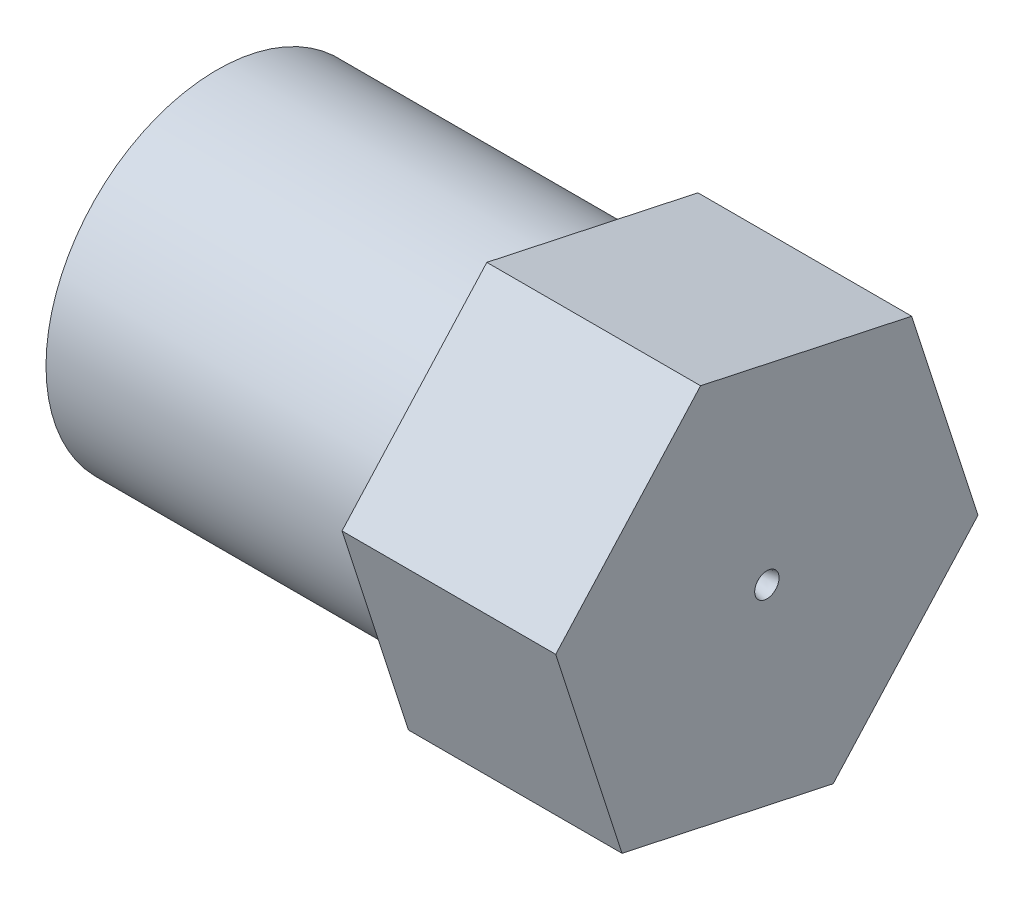
ISO-10303-21;
HEADER;
FILE_DESCRIPTION(('STEP AP214'),'2;1');
FILE_NAME('part.step','',(''),(''),'','','');
FILE_SCHEMA(('AUTOMOTIVE_DESIGN { 1 0 10303 214 1 1 1 1 }'));
ENDSEC;
DATA;
#1=APPLICATION_CONTEXT('core data for automotive mechanical design processes');
#2=APPLICATION_PROTOCOL_DEFINITION('international standard','automotive_design',2000,#1);
#3=PRODUCT_CONTEXT('',#1,'mechanical');
#4=PRODUCT('Part','Part','',(#3));
#5=PRODUCT_RELATED_PRODUCT_CATEGORY('part','',(#4));
#6=PRODUCT_DEFINITION_FORMATION('','',#4);
#7=PRODUCT_DEFINITION_CONTEXT('part definition',#1,'design');
#8=PRODUCT_DEFINITION('design','',#6,#7);
#9=PRODUCT_DEFINITION_SHAPE('','',#8);
#10=(LENGTH_UNIT() NAMED_UNIT(*) SI_UNIT(.MILLI.,.METRE.));
#11=(NAMED_UNIT(*) PLANE_ANGLE_UNIT() SI_UNIT($,.RADIAN.));
#12=(NAMED_UNIT(*) SI_UNIT($,.STERADIAN.) SOLID_ANGLE_UNIT());
#13=UNCERTAINTY_MEASURE_WITH_UNIT(LENGTH_MEASURE(1.E-05),#10,'distance_accuracy_value','');
#14=(GEOMETRIC_REPRESENTATION_CONTEXT(3) GLOBAL_UNCERTAINTY_ASSIGNED_CONTEXT((#13)) GLOBAL_UNIT_ASSIGNED_CONTEXT((#10,
#11,#12)) REPRESENTATION_CONTEXT('',''));
#15=CARTESIAN_POINT('',(0.,0.,0.));
#16=DIRECTION('',(0.,0.,1.));
#17=DIRECTION('',(1.,0.,0.));
#18=AXIS2_PLACEMENT_3D('',#15,#16,#17);
#19=CARTESIAN_POINT('',(0.,0.,0.));
#20=DIRECTION('',(-1.,0.,0.));
#21=DIRECTION('',(0.,0.,1.));
#22=AXIS2_PLACEMENT_3D('',#19,#20,#21);
#23=CYLINDRICAL_SURFACE('',#22,10.16);
#24=CARTESIAN_POINT('',(-12.4100399321107,0.,0.));
#25=DIRECTION('',(1.,0.,0.));
#26=DIRECTION('',(0.,0.,-1.));
#27=AXIS2_PLACEMENT_3D('',#24,#25,#26);
#28=CIRCLE('',#27,10.16);
#29=CARTESIAN_POINT('',(-12.4100399321107,0.,-10.16));
#30=VERTEX_POINT('',#29);
#31=EDGE_CURVE('E11',#30,#30,#28,.F.);
#32=ORIENTED_EDGE('',*,*,#31,.T.);
#33=EDGE_LOOP('',(#32));
#34=FACE_BOUND('',#33,.T.);
#35=CARTESIAN_POINT('',(-31.75,0.,0.));
#36=DIRECTION('',(-1.,0.,0.));
#37=DIRECTION('',(0.,0.,1.));
#38=AXIS2_PLACEMENT_3D('',#35,#36,#37);
#39=CIRCLE('',#38,10.16);
#40=CARTESIAN_POINT('',(-31.75,0.,10.16));
#41=VERTEX_POINT('',#40);
#42=EDGE_CURVE('E227',#41,#41,#39,.T.);
#43=ORIENTED_EDGE('',*,*,#42,.F.);
#44=EDGE_LOOP('',(#43));
#45=FACE_BOUND('',#44,.T.);
#46=ADVANCED_FACE('F39',(#34,#45),#23,.T.);
#47=CARTESIAN_POINT('',(0.,0.,0.));
#48=DIRECTION('',(-1.,0.,0.));
#49=DIRECTION('',(0.,0.,1.));
#50=AXIS2_PLACEMENT_3D('',#47,#48,#49);
#51=TOROIDAL_SURFACE('',#50,1.25,0.75);
#52=CARTESIAN_POINT('',(0.,0.,0.));
#53=DIRECTION('',(-1.,0.,0.));
#54=DIRECTION('',(0.,0.,1.));
#55=AXIS2_PLACEMENT_3D('',#52,#53,#54);
#56=CIRCLE('',#55,0.500000002399503);
#57=CARTESIAN_POINT('',(0.,0.,0.500000002399503));
#58=VERTEX_POINT('',#57);
#59=EDGE_CURVE('E179',#58,#58,#56,.T.);
#60=ORIENTED_EDGE('',*,*,#59,.F.);
#61=EDGE_LOOP('',(#60));
#62=FACE_BOUND('',#61,.T.);
#63=CARTESIAN_POINT('',(-0.530330085889904,0.,0.));
#64=DIRECTION('',(-1.,0.,0.));
#65=DIRECTION('',(0.,0.,1.));
#66=AXIS2_PLACEMENT_3D('',#63,#64,#65);
#67=CIRCLE('',#66,0.719669914110083);
#68=CARTESIAN_POINT('',(-0.530330085889904,0.,0.719669914110083));
#69=VERTEX_POINT('',#68);
#70=EDGE_CURVE('E144',#69,#69,#67,.T.);
#71=ORIENTED_EDGE('',*,*,#70,.T.);
#72=EDGE_LOOP('',(#71));
#73=FACE_BOUND('',#72,.T.);
#74=ADVANCED_FACE('F168',(#62,#73),#51,.T.);
#75=CARTESIAN_POINT('',(0.,0.,0.));
#76=DIRECTION('',(-1.,0.,0.));
#77=DIRECTION('',(0.,0.,1.));
#78=AXIS2_PLACEMENT_3D('',#75,#76,#77);
#79=TOROIDAL_SURFACE('',#78,0.7,0.199999997600497);
#80=CARTESIAN_POINT('',(0.0684040273467579,0.,0.));
#81=DIRECTION('',(-1.,0.,0.));
#82=DIRECTION('',(0.,0.,1.));
#83=AXIS2_PLACEMENT_3D('',#80,#81,#82);
#84=CIRCLE('',#83,0.512061480485049);
#85=CARTESIAN_POINT('',(0.0684040273467579,0.,0.512061480485049));
#86=VERTEX_POINT('',#85);
#87=EDGE_CURVE('E233',#86,#86,#84,.T.);
#88=ORIENTED_EDGE('',*,*,#87,.F.);
#89=EDGE_LOOP('',(#88));
#90=FACE_BOUND('',#89,.T.);
#91=ORIENTED_EDGE('',*,*,#59,.T.);
#92=EDGE_LOOP('',(#91));
#93=FACE_BOUND('',#92,.T.);
#94=ADVANCED_FACE('F164',(#90,#93),#79,.T.);
#95=CARTESIAN_POINT('',(339319.941654848,-940674.926656256,0.));
#96=CARTESIAN_POINT('',(-342020.074953352,939693.132835847,0.));
#97=CARTESIAN_POINT('',(344720.481867964,-938709.290769517,0.));
#98=B_SPLINE_CURVE_WITH_KNOTS('',2,(#95,#96,#97),.UNSPECIFIED.,.F.,.F.,(3,3),(0.,1.),.UNSPECIFIED.);
#99=CARTESIAN_POINT('',(0.,0.,0.));
#100=DIRECTION('',(-1.,0.,0.));
#101=AXIS1_PLACEMENT('',#99,#100);
#102=SURFACE_OF_REVOLUTION('',#98,#101);
#103=CARTESIAN_POINT('',(0.924960067644267,0.,0.));
#104=DIRECTION('',(-1.,0.,0.));
#105=DIRECTION('',(0.,0.,1.));
#106=AXIS2_PLACEMENT_3D('',#103,#104,#105);
#107=CIRCLE('',#106,0.724568837309472);
#108=CARTESIAN_POINT('',(0.924960067644267,0.,0.724568837309472));
#109=VERTEX_POINT('',#108);
#110=EDGE_CURVE('E230',#109,#109,#107,.T.);
#111=ORIENTED_EDGE('',*,*,#110,.F.);
#112=EDGE_LOOP('',(#111));
#113=FACE_BOUND('',#112,.T.);
#114=ORIENTED_EDGE('',*,*,#87,.T.);
#115=EDGE_LOOP('',(#114));
#116=FACE_BOUND('',#115,.T.);
#117=ADVANCED_FACE('F159',(#113,#116),#102,.T.);
#118=CARTESIAN_POINT('',(0.924960067889328,10.16,0.));
#119=DIRECTION('',(-1.,0.,0.));
#120=DIRECTION('',(0.,0.,1.));
#121=AXIS2_PLACEMENT_3D('',#118,#119,#120);
#122=PLANE('',#121);
#123=ORIENTED_EDGE('',*,*,#110,.T.);
#124=EDGE_LOOP('',(#123));
#125=FACE_BOUND('',#124,.T.);
#126=DIRECTION('',(0.,-0.951681663898051,-0.307086324345838));
#127=VECTOR('',#126,1.);
#128=CARTESIAN_POINT('',(0.924960067889328,-3.41249677929312,10.5755624900671));
#129=LINE('',#128,#127);
#130=CARTESIAN_POINT('',(0.924960067889328,2.69330707117882,12.5457684242007));
#131=VERTEX_POINT('',#130);
#132=CARTESIAN_POINT('',(0.924960067889328,-9.51830062976507,8.60535655593348));
#133=VERTEX_POINT('',#132);
#134=EDGE_CURVE('E127',#131,#133,#129,.T.);
#135=ORIENTED_EDGE('',*,*,#134,.T.);
#136=DIRECTION('',(0.,-0.209896273910742,-0.977723659424475));
#137=VECTOR('',#136,1.);
#138=CARTESIAN_POINT('',(0.924960067889328,-10.8649541653545,2.33247234383312));
#139=LINE('',#138,#137);
#140=CARTESIAN_POINT('',(0.924960067889328,-12.2116077009439,-3.94041186826723));
#141=VERTEX_POINT('',#140);
#142=EDGE_CURVE('E130',#133,#141,#139,.T.);
#143=ORIENTED_EDGE('',*,*,#142,.T.);
#144=DIRECTION('',(0.,0.741785389987309,-0.670637335078637));
#145=VECTOR('',#144,1.);
#146=CARTESIAN_POINT('',(0.924960067889328,-7.45245738606136,-8.24309014623397));
#147=LINE('',#146,#145);
#148=CARTESIAN_POINT('',(0.924960067889328,-2.69330707117882,-12.5457684242007));
#149=VERTEX_POINT('',#148);
#150=EDGE_CURVE('E133',#141,#149,#147,.T.);
#151=ORIENTED_EDGE('',*,*,#150,.T.);
#152=DIRECTION('',(0.,0.951681663898051,0.307086324345838));
#153=VECTOR('',#152,1.);
#154=CARTESIAN_POINT('',(0.924960067889328,3.41249677929312,-10.5755624900671));
#155=LINE('',#154,#153);
#156=CARTESIAN_POINT('',(0.924960067889328,9.51830062976506,-8.60535655593348));
#157=VERTEX_POINT('',#156);
#158=EDGE_CURVE('E136',#149,#157,#155,.T.);
#159=ORIENTED_EDGE('',*,*,#158,.T.);
#160=DIRECTION('',(0.,0.209896273910742,0.977723659424475));
#161=VECTOR('',#160,1.);
#162=CARTESIAN_POINT('',(0.924960067889328,10.8649541653545,-2.33247234383312));
#163=LINE('',#162,#161);
#164=CARTESIAN_POINT('',(0.924960067889328,12.2116077009439,3.94041186826724));
#165=VERTEX_POINT('',#164);
#166=EDGE_CURVE('E104',#157,#165,#163,.T.);
#167=ORIENTED_EDGE('',*,*,#166,.T.);
#168=DIRECTION('',(0.,-0.741785389987309,0.670637335078637));
#169=VECTOR('',#168,1.);
#170=CARTESIAN_POINT('',(0.924960067889328,7.45245738606136,8.24309014623397));
#171=LINE('',#170,#169);
#172=EDGE_CURVE('E139',#165,#131,#171,.T.);
#173=ORIENTED_EDGE('',*,*,#172,.T.);
#174=EDGE_LOOP('',(#135,#143,#151,#159,#167,#173));
#175=FACE_BOUND('',#174,.T.);
#176=ADVANCED_FACE('F163',(#125,#175),#122,.F.);
#177=CARTESIAN_POINT('',(-31.75,10.16,0.));
#178=DIRECTION('',(1.,0.,0.));
#179=DIRECTION('',(0.,0.,-1.));
#180=AXIS2_PLACEMENT_3D('',#177,#178,#179);
#181=PLANE('',#180);
#182=CARTESIAN_POINT('',(-31.75,0.,0.));
#183=DIRECTION('',(-1.,0.,0.));
#184=DIRECTION('',(0.,0.,1.));
#185=AXIS2_PLACEMENT_3D('',#182,#183,#184);
#186=CIRCLE('',#185,8.6614);
#187=CARTESIAN_POINT('',(-31.75,0.,8.6614));
#188=VERTEX_POINT('',#187);
#189=EDGE_CURVE('E224',#188,#188,#186,.T.);
#190=ORIENTED_EDGE('',*,*,#189,.F.);
#191=EDGE_LOOP('',(#190));
#192=FACE_BOUND('',#191,.T.);
#193=ORIENTED_EDGE('',*,*,#42,.T.);
#194=EDGE_LOOP('',(#193));
#195=FACE_BOUND('',#194,.T.);
#196=ADVANCED_FACE('F251',(#192,#195),#181,.F.);
#197=CARTESIAN_POINT('',(-31.115,0.,0.));
#198=DIRECTION('',(-1.,0.,0.));
#199=DIRECTION('',(0.,0.,1.));
#200=AXIS2_PLACEMENT_3D('',#197,#198,#199);
#201=TOROIDAL_SURFACE('',#200,8.6614,0.635);
#202=CARTESIAN_POINT('',(-31.115,0.,0.));
#203=DIRECTION('',(-1.,0.,0.));
#204=DIRECTION('',(0.,0.,1.));
#205=AXIS2_PLACEMENT_3D('',#202,#203,#204);
#206=CIRCLE('',#205,8.02639999999999);
#207=CARTESIAN_POINT('',(-31.115,0.,8.02639999999999));
#208=VERTEX_POINT('',#207);
#209=EDGE_CURVE('E221',#208,#208,#206,.T.);
#210=ORIENTED_EDGE('',*,*,#209,.F.);
#211=EDGE_LOOP('',(#210));
#212=FACE_BOUND('',#211,.T.);
#213=ORIENTED_EDGE('',*,*,#189,.T.);
#214=EDGE_LOOP('',(#213));
#215=FACE_BOUND('',#214,.T.);
#216=ADVANCED_FACE('F253',(#212,#215),#201,.T.);
#217=CARTESIAN_POINT('',(0.,0.,0.));
#218=DIRECTION('',(-1.,0.,0.));
#219=DIRECTION('',(0.,0.,1.));
#220=AXIS2_PLACEMENT_3D('',#217,#218,#219);
#221=CYLINDRICAL_SURFACE('',#220,8.02639999999999);
#222=CARTESIAN_POINT('',(-25.019,0.,0.));
#223=DIRECTION('',(-1.,0.,0.));
#224=DIRECTION('',(0.,0.,1.));
#225=AXIS2_PLACEMENT_3D('',#222,#223,#224);
#226=CIRCLE('',#225,8.02639999999999);
#227=CARTESIAN_POINT('',(-25.019,0.,8.02639999999999));
#228=VERTEX_POINT('',#227);
#229=EDGE_CURVE('E218',#228,#228,#226,.T.);
#230=ORIENTED_EDGE('',*,*,#229,.F.);
#231=EDGE_LOOP('',(#230));
#232=FACE_BOUND('',#231,.T.);
#233=ORIENTED_EDGE('',*,*,#209,.T.);
#234=EDGE_LOOP('',(#233));
#235=FACE_BOUND('',#234,.T.);
#236=ADVANCED_FACE('F260',(#232,#235),#221,.F.);
#237=CARTESIAN_POINT('',(-25.019,0.,0.));
#238=DIRECTION('',(-1.,0.,0.));
#239=DIRECTION('',(0.,0.,1.));
#240=AXIS2_PLACEMENT_3D('',#237,#238,#239);
#241=TOROIDAL_SURFACE('',#240,7.89939999999999,0.127);
#242=CARTESIAN_POINT('',(-24.892,0.,0.));
#243=DIRECTION('',(-1.,0.,0.));
#244=DIRECTION('',(0.,0.,1.));
#245=AXIS2_PLACEMENT_3D('',#242,#243,#244);
#246=CIRCLE('',#245,7.89939999999999);
#247=CARTESIAN_POINT('',(-24.892,0.,7.89939999999999));
#248=VERTEX_POINT('',#247);
#249=EDGE_CURVE('E215',#248,#248,#246,.T.);
#250=ORIENTED_EDGE('',*,*,#249,.F.);
#251=EDGE_LOOP('',(#250));
#252=FACE_BOUND('',#251,.T.);
#253=ORIENTED_EDGE('',*,*,#229,.T.);
#254=EDGE_LOOP('',(#253));
#255=FACE_BOUND('',#254,.T.);
#256=ADVANCED_FACE('F268',(#252,#255),#241,.F.);
#257=CARTESIAN_POINT('',(-24.892,6.9469,0.));
#258=DIRECTION('',(1.,0.,0.));
#259=DIRECTION('',(0.,0.,-1.));
#260=AXIS2_PLACEMENT_3D('',#257,#258,#259);
#261=PLANE('',#260);
#262=CARTESIAN_POINT('',(-24.892,0.,0.));
#263=DIRECTION('',(-1.,0.,0.));
#264=DIRECTION('',(0.,0.,1.));
#265=AXIS2_PLACEMENT_3D('',#262,#263,#264);
#266=CIRCLE('',#265,6.9469);
#267=CARTESIAN_POINT('',(-24.892,0.,6.9469));
#268=VERTEX_POINT('',#267);
#269=EDGE_CURVE('E212',#268,#268,#266,.T.);
#270=ORIENTED_EDGE('',*,*,#269,.F.);
#271=EDGE_LOOP('',(#270));
#272=FACE_BOUND('',#271,.T.);
#273=ORIENTED_EDGE('',*,*,#249,.T.);
#274=EDGE_LOOP('',(#273));
#275=FACE_BOUND('',#274,.T.);
#276=ADVANCED_FACE('F272',(#272,#275),#261,.F.);
#277=CARTESIAN_POINT('',(0.,0.,0.));
#278=DIRECTION('',(-1.,0.,0.));
#279=DIRECTION('',(0.,0.,1.));
#280=AXIS2_PLACEMENT_3D('',#277,#278,#279);
#281=CYLINDRICAL_SURFACE('',#280,6.9469);
#282=CARTESIAN_POINT('',(-20.066,0.,0.));
#283=DIRECTION('',(-1.,0.,0.));
#284=DIRECTION('',(0.,0.,1.));
#285=AXIS2_PLACEMENT_3D('',#282,#283,#284);
#286=CIRCLE('',#285,6.9469);
#287=CARTESIAN_POINT('',(-20.066,0.,6.9469));
#288=VERTEX_POINT('',#287);
#289=EDGE_CURVE('E209',#288,#288,#286,.T.);
#290=ORIENTED_EDGE('',*,*,#289,.F.);
#291=EDGE_LOOP('',(#290));
#292=FACE_BOUND('',#291,.T.);
#293=ORIENTED_EDGE('',*,*,#269,.T.);
#294=EDGE_LOOP('',(#293));
#295=FACE_BOUND('',#294,.T.);
#296=ADVANCED_FACE('F276',(#292,#295),#281,.F.);
#297=CARTESIAN_POINT('',(-20.066,0.,0.));
#298=DIRECTION('',(-1.,0.,0.));
#299=DIRECTION('',(0.,0.,1.));
#300=AXIS2_PLACEMENT_3D('',#297,#298,#299);
#301=TOROIDAL_SURFACE('',#300,6.8199,0.127);
#302=CARTESIAN_POINT('',(-19.939,0.,0.));
#303=DIRECTION('',(-1.,0.,0.));
#304=DIRECTION('',(0.,0.,1.));
#305=AXIS2_PLACEMENT_3D('',#302,#303,#304);
#306=CIRCLE('',#305,6.8199);
#307=CARTESIAN_POINT('',(-19.939,0.,6.8199));
#308=VERTEX_POINT('',#307);
#309=EDGE_CURVE('E206',#308,#308,#306,.T.);
#310=ORIENTED_EDGE('',*,*,#309,.F.);
#311=EDGE_LOOP('',(#310));
#312=FACE_BOUND('',#311,.T.);
#313=ORIENTED_EDGE('',*,*,#289,.T.);
#314=EDGE_LOOP('',(#313));
#315=FACE_BOUND('',#314,.T.);
#316=ADVANCED_FACE('F280',(#312,#315),#301,.F.);
#317=CARTESIAN_POINT('',(-19.939,5.46100000000001,0.));
#318=DIRECTION('',(1.,0.,0.));
#319=DIRECTION('',(0.,0.,-1.));
#320=AXIS2_PLACEMENT_3D('',#317,#318,#319);
#321=PLANE('',#320);
#322=CARTESIAN_POINT('',(-19.939,0.,0.));
#323=DIRECTION('',(-1.,0.,0.));
#324=DIRECTION('',(0.,0.,1.));
#325=AXIS2_PLACEMENT_3D('',#322,#323,#324);
#326=CIRCLE('',#325,5.46100000000001);
#327=CARTESIAN_POINT('',(-19.939,0.,5.46100000000001));
#328=VERTEX_POINT('',#327);
#329=EDGE_CURVE('E203',#328,#328,#326,.T.);
#330=ORIENTED_EDGE('',*,*,#329,.F.);
#331=EDGE_LOOP('',(#330));
#332=FACE_BOUND('',#331,.T.);
#333=ORIENTED_EDGE('',*,*,#309,.T.);
#334=EDGE_LOOP('',(#333));
#335=FACE_BOUND('',#334,.T.);
#336=ADVANCED_FACE('F284',(#332,#335),#321,.F.);
#337=CARTESIAN_POINT('',(-19.304,0.,0.));
#338=DIRECTION('',(-1.,0.,0.));
#339=DIRECTION('',(0.,0.,1.));
#340=AXIS2_PLACEMENT_3D('',#337,#338,#339);
#341=TOROIDAL_SURFACE('',#340,5.461,0.635);
#342=CARTESIAN_POINT('',(-19.304,0.,0.));
#343=DIRECTION('',(-1.,0.,0.));
#344=DIRECTION('',(0.,0.,1.));
#345=AXIS2_PLACEMENT_3D('',#342,#343,#344);
#346=CIRCLE('',#345,4.826);
#347=CARTESIAN_POINT('',(-19.304,0.,4.826));
#348=VERTEX_POINT('',#347);
#349=EDGE_CURVE('E200',#348,#348,#346,.T.);
#350=ORIENTED_EDGE('',*,*,#349,.F.);
#351=EDGE_LOOP('',(#350));
#352=FACE_BOUND('',#351,.T.);
#353=ORIENTED_EDGE('',*,*,#329,.T.);
#354=EDGE_LOOP('',(#353));
#355=FACE_BOUND('',#354,.T.);
#356=ADVANCED_FACE('F288',(#352,#355),#341,.T.);
#357=CARTESIAN_POINT('',(0.,0.,0.));
#358=DIRECTION('',(-1.,0.,0.));
#359=DIRECTION('',(0.,0.,1.));
#360=AXIS2_PLACEMENT_3D('',#357,#358,#359);
#361=CYLINDRICAL_SURFACE('',#360,4.826);
#362=CARTESIAN_POINT('',(-13.589,0.,0.));
#363=DIRECTION('',(-1.,0.,0.));
#364=DIRECTION('',(0.,0.,1.));
#365=AXIS2_PLACEMENT_3D('',#362,#363,#364);
#366=CIRCLE('',#365,4.826);
#367=CARTESIAN_POINT('',(-13.589,0.,4.826));
#368=VERTEX_POINT('',#367);
#369=EDGE_CURVE('E197',#368,#368,#366,.T.);
#370=ORIENTED_EDGE('',*,*,#369,.F.);
#371=EDGE_LOOP('',(#370));
#372=FACE_BOUND('',#371,.T.);
#373=ORIENTED_EDGE('',*,*,#349,.T.);
#374=EDGE_LOOP('',(#373));
#375=FACE_BOUND('',#374,.T.);
#376=ADVANCED_FACE('F292',(#372,#375),#361,.F.);
#377=CARTESIAN_POINT('',(-13.589,0.,0.));
#378=DIRECTION('',(-1.,0.,0.));
#379=DIRECTION('',(0.,0.,1.));
#380=AXIS2_PLACEMENT_3D('',#377,#378,#379);
#381=TOROIDAL_SURFACE('',#380,4.699,0.127);
#382=CARTESIAN_POINT('',(-13.462,0.,0.));
#383=DIRECTION('',(-1.,0.,0.));
#384=DIRECTION('',(0.,0.,1.));
#385=AXIS2_PLACEMENT_3D('',#382,#383,#384);
#386=CIRCLE('',#385,4.699);
#387=CARTESIAN_POINT('',(-13.462,0.,4.699));
#388=VERTEX_POINT('',#387);
#389=EDGE_CURVE('E194',#388,#388,#386,.T.);
#390=ORIENTED_EDGE('',*,*,#389,.F.);
#391=EDGE_LOOP('',(#390));
#392=FACE_BOUND('',#391,.T.);
#393=ORIENTED_EDGE('',*,*,#369,.T.);
#394=EDGE_LOOP('',(#393));
#395=FACE_BOUND('',#394,.T.);
#396=ADVANCED_FACE('F296',(#392,#395),#381,.F.);
#397=CARTESIAN_POINT('',(-13.462,4.445,0.));
#398=DIRECTION('',(1.,0.,0.));
#399=DIRECTION('',(0.,0.,-1.));
#400=AXIS2_PLACEMENT_3D('',#397,#398,#399);
#401=PLANE('',#400);
#402=CARTESIAN_POINT('',(-13.462,0.,0.));
#403=DIRECTION('',(-1.,0.,0.));
#404=DIRECTION('',(0.,0.,1.));
#405=AXIS2_PLACEMENT_3D('',#402,#403,#404);
#406=CIRCLE('',#405,4.445);
#407=CARTESIAN_POINT('',(-13.462,0.,4.445));
#408=VERTEX_POINT('',#407);
#409=EDGE_CURVE('E189',#408,#408,#406,.T.);
#410=ORIENTED_EDGE('',*,*,#409,.F.);
#411=EDGE_LOOP('',(#410));
#412=FACE_BOUND('',#411,.T.);
#413=ORIENTED_EDGE('',*,*,#389,.T.);
#414=EDGE_LOOP('',(#413));
#415=FACE_BOUND('',#414,.T.);
#416=ADVANCED_FACE('F300',(#412,#415),#401,.F.);
#417=CARTESIAN_POINT('',(0.,0.,0.));
#418=DIRECTION('',(-1.,0.,0.));
#419=DIRECTION('',(0.,0.,1.));
#420=AXIS2_PLACEMENT_3D('',#417,#418,#419);
#421=CYLINDRICAL_SURFACE('',#420,4.445);
#422=CARTESIAN_POINT('',(-5.57078823231446,0.,0.));
#423=DIRECTION('',(-1.,0.,0.));
#424=DIRECTION('',(0.,0.,1.));
#425=AXIS2_PLACEMENT_3D('',#422,#423,#424);
#426=CIRCLE('',#425,4.445);
#427=CARTESIAN_POINT('',(-5.57078823231446,0.,4.445));
#428=VERTEX_POINT('',#427);
#429=EDGE_CURVE('E185',#428,#428,#426,.T.);
#430=ORIENTED_EDGE('',*,*,#429,.F.);
#431=EDGE_LOOP('',(#430));
#432=FACE_BOUND('',#431,.T.);
#433=ORIENTED_EDGE('',*,*,#409,.T.);
#434=EDGE_LOOP('',(#433));
#435=FACE_BOUND('',#434,.T.);
#436=ADVANCED_FACE('F304',(#432,#435),#421,.F.);
#437=CARTESIAN_POINT('',(-5.57078823231446,0.,0.));
#438=DIRECTION('',(-1.,0.,0.));
#439=DIRECTION('',(0.,0.,1.));
#440=AXIS2_PLACEMENT_3D('',#437,#438,#439);
#441=DEGENERATE_TOROIDAL_SURFACE('',#440,1.27,3.175,.T.);
#442=CARTESIAN_POINT('',(-3.3257242020472,0.,0.));
#443=DIRECTION('',(-1.,0.,0.));
#444=DIRECTION('',(0.,0.,1.));
#445=AXIS2_PLACEMENT_3D('',#442,#443,#444);
#446=CIRCLE('',#445,3.51506403026731);
#447=CARTESIAN_POINT('',(-3.3257242020472,0.,3.51506403026731));
#448=VERTEX_POINT('',#447);
#449=EDGE_CURVE('E183',#448,#448,#446,.T.);
#450=ORIENTED_EDGE('',*,*,#449,.F.);
#451=EDGE_LOOP('',(#450));
#452=FACE_BOUND('',#451,.T.);
#453=ORIENTED_EDGE('',*,*,#429,.T.);
#454=EDGE_LOOP('',(#453));
#455=FACE_BOUND('',#454,.T.);
#456=ADVANCED_FACE('F308',(#452,#455),#441,.F.);
#457=CARTESIAN_POINT('',(-3.3257242020472,0.,0.));
#458=DIRECTION('',(-1.,0.,0.));
#459=DIRECTION('',(0.,0.,1.));
#460=AXIS2_PLACEMENT_3D('',#457,#458,#459);
#461=CONICAL_SURFACE('',#460,3.51506403026731,0.785398163397437);
#462=CARTESIAN_POINT('',(-0.530330085889904,0.,0.719669914110083));
#463=CARTESIAN_POINT('',(-0.559448774599877,0.,0.748788602820054));
#464=CARTESIAN_POINT('',(-0.588567463309848,0.,0.777907291530025));
#465=CARTESIAN_POINT('',(-0.646804840729792,0.,0.836144668949968));
#466=CARTESIAN_POINT('',(-0.675923529439764,0.,0.865263357659939));
#467=CARTESIAN_POINT('',(-0.734160906859707,0.,0.923500735079882));
#468=CARTESIAN_POINT('',(-0.763279595569679,0.,0.952619423789853));
#469=CARTESIAN_POINT('',(-0.821516972989623,0.,1.01085680120979));
#470=CARTESIAN_POINT('',(-0.850635661699594,0.,1.03997548991977));
#471=CARTESIAN_POINT('',(-0.908873039119538,0.,1.09821286733971));
#472=CARTESIAN_POINT('',(-0.93799172782951,0.,1.12733155604968));
#473=CARTESIAN_POINT('',(-0.996229105249454,0.,1.18556893346962));
#474=CARTESIAN_POINT('',(-1.02534779395943,0.,1.21468762217959));
#475=CARTESIAN_POINT('',(-1.08358517137937,0.,1.27292499959953));
#476=CARTESIAN_POINT('',(-1.11270386008934,0.,1.30204368830951));
#477=CARTESIAN_POINT('',(-1.17094123750928,0.,1.36028106572945));
#478=CARTESIAN_POINT('',(-1.20005992621926,0.,1.38939975443942));
#479=CARTESIAN_POINT('',(-1.2582973036392,0.,1.44763713185936));
#480=CARTESIAN_POINT('',(-1.28741599234917,0.,1.47675582056933));
#481=CARTESIAN_POINT('',(-1.34565336976912,0.,1.53499319798928));
#482=CARTESIAN_POINT('',(-1.37477205847909,0.,1.56411188669925));
#483=CARTESIAN_POINT('',(-1.43300943589903,0.,1.62234926411919));
#484=CARTESIAN_POINT('',(-1.462128124609,0.,1.65146795282916));
#485=CARTESIAN_POINT('',(-1.52036550202895,0.,1.7097053302491));
#486=CARTESIAN_POINT('',(-1.54948419073892,0.,1.73882401895907));
#487=CARTESIAN_POINT('',(-1.60772156815886,0.,1.79706139637902));
#488=CARTESIAN_POINT('',(-1.63684025686883,0.,1.82618008508899));
#489=CARTESIAN_POINT('',(-1.69507763428878,0.,1.88441746250893));
#490=CARTESIAN_POINT('',(-1.72419632299875,0.,1.9135361512189));
#491=CARTESIAN_POINT('',(-1.78243370041869,0.,1.97177352863884));
#492=CARTESIAN_POINT('',(-1.81155238912866,0.,2.00089221734881));
#493=CARTESIAN_POINT('',(-1.86978976654861,0.,2.05912959476876));
#494=CARTESIAN_POINT('',(-1.89890845525858,0.,2.08824828347873));
#495=CARTESIAN_POINT('',(-1.95714583267852,0.,2.14648566089867));
#496=CARTESIAN_POINT('',(-1.9862645213885,0.,2.17560434960864));
#497=CARTESIAN_POINT('',(-2.04450189880844,0.,2.23384172702858));
#498=CARTESIAN_POINT('',(-2.07362058751841,0.,2.26296041573855));
#499=CARTESIAN_POINT('',(-2.13185796493836,0.,2.3211977931585));
#500=CARTESIAN_POINT('',(-2.16097665364833,0.,2.35031648186847));
#501=CARTESIAN_POINT('',(-2.21921403106827,0.,2.40855385928841));
#502=CARTESIAN_POINT('',(-2.24833271977824,0.,2.43767254799838));
#503=CARTESIAN_POINT('',(-2.30657009719819,0.,2.49590992541832));
#504=CARTESIAN_POINT('',(-2.33568878590816,0.,2.52502861412829));
#505=CARTESIAN_POINT('',(-2.3939261633281,0.,2.58326599154824));
#506=CARTESIAN_POINT('',(-2.42304485203807,0.,2.61238468025821));
#507=CARTESIAN_POINT('',(-2.48128222945802,0.,2.67062205767815));
#508=CARTESIAN_POINT('',(-2.51040091816799,0.,2.69974074638812));
#509=CARTESIAN_POINT('',(-2.56863829558793,0.,2.75797812380806));
#510=CARTESIAN_POINT('',(-2.5977569842979,0.,2.78709681251803));
#511=CARTESIAN_POINT('',(-2.65599436171785,0.,2.84533418993798));
#512=CARTESIAN_POINT('',(-2.68511305042782,0.,2.87445287864795));
#513=CARTESIAN_POINT('',(-2.74335042784776,0.,2.93269025606789));
#514=CARTESIAN_POINT('',(-2.77246911655774,0.,2.96180894477786));
#515=CARTESIAN_POINT('',(-2.83070649397768,0.,3.0200463221978));
#516=CARTESIAN_POINT('',(-2.85982518268765,0.,3.04916501090777));
#517=CARTESIAN_POINT('',(-2.91806256010759,0.,3.10740238832772));
#518=CARTESIAN_POINT('',(-2.94718124881757,0.,3.13652107703769));
#519=CARTESIAN_POINT('',(-3.00541862623751,0.,3.19475845445763));
#520=CARTESIAN_POINT('',(-3.03453731494748,0.,3.2238771431676));
#521=CARTESIAN_POINT('',(-3.09277469236743,0.,3.28211452058754));
#522=CARTESIAN_POINT('',(-3.1218933810774,0.,3.31123320929751));
#523=CARTESIAN_POINT('',(-3.18013075849734,0.,3.36947058671746));
#524=CARTESIAN_POINT('',(-3.20924944720731,0.,3.39858927542743));
#525=CARTESIAN_POINT('',(-3.26748682462726,0.,3.45682665284737));
#526=CARTESIAN_POINT('',(-3.29660551333723,0.,3.48594534155734));
#527=CARTESIAN_POINT('',(-3.3257242020472,0.,3.51506403026731));
#528=B_SPLINE_CURVE_WITH_KNOTS('',3,(#462,#463,#464,#465,#466,#467,#468,#469,#470,#471,#472,
#473,#474,#475,#476,#477,#478,#479,#480,#481,#482,#483,#484,#485,#486,#487,#488,#489,#490,#491,
#492,#493,#494,#495,#496,#497,#498,#499,#500,#501,#502,#503,#504,#505,#506,#507,#508,#509,#510,
#511,#512,#513,#514,#515,#516,#517,#518,#519,#520,#521,#522,#523,#524,#525,#526,#527),
.UNSPECIFIED.,.F.,.F.,(4,2,2,2,2,2,2,2,2,2,2,2,2,2,2,2,2,2,2,2,2,2,2,2,2,2,2,2,2,2,2,2,4),(0.,
0.123540133476486,0.247080266952972,0.370620400429458,0.494160533905944,0.61770066738243,
0.741240800858915,0.864780934335402,0.988321067811888,1.11186120128837,1.23540133476486,
1.35894146824135,1.48248160171783,1.60602173519432,1.7295618686708,1.85310200214729,
1.97664213562378,2.10018226910026,2.22372240257675,2.34726253605323,2.47080266952972,
2.59434280300621,2.71788293648269,2.84142306995918,2.96496320343566,3.08850333691215,
3.21204347038864,3.33558360386512,3.45912373734161,3.58266387081809,3.70620400429458,
3.82974413777107,3.95328427124755),.UNSPECIFIED.);
#529=EDGE_CURVE('BSEAM312',#69,#448,#528,.T.);
#530=ORIENTED_EDGE('',*,*,#70,.F.);
#531=ORIENTED_EDGE('',*,*,#449,.T.);
#532=ORIENTED_EDGE('',*,*,#529,.T.);
#533=ORIENTED_EDGE('',*,*,#529,.F.);
#534=EDGE_LOOP('',(#530,#532,#531,#533));
#535=FACE_BOUND('',#534,.T.);
#536=ADVANCED_FACE('F312',(#535),#461,.F.);
#537=CARTESIAN_POINT('',(-11.7750399321107,-3.41249677929312,10.5755624900671));
#538=DIRECTION('',(0.,-0.307086324345838,0.951681663898051));
#539=DIRECTION('',(0.,-0.951681663898051,-0.307086324345838));
#540=AXIS2_PLACEMENT_3D('',#537,#538,#539);
#541=PLANE('',#540);
#542=ORIENTED_EDGE('',*,*,#134,.F.);
#543=DIRECTION('',(1.,0.,0.));
#544=VECTOR('',#543,1.);
#545=CARTESIAN_POINT('',(-11.7750399321107,2.69330707117882,12.5457684242007));
#546=LINE('',#545,#544);
#547=CARTESIAN_POINT('',(-11.7750399321107,2.69330707117882,12.5457684242007));
#548=VERTEX_POINT('',#547);
#549=EDGE_CURVE('E56',#548,#131,#546,.T.);
#550=ORIENTED_EDGE('',*,*,#549,.F.);
#551=DIRECTION('',(0.,-0.951681663898051,-0.307086324345838));
#552=VECTOR('',#551,1.);
#553=CARTESIAN_POINT('',(-11.7750399321107,-3.41249677929312,10.5755624900671));
#554=LINE('',#553,#552);
#555=CARTESIAN_POINT('',(-11.7750399321107,-9.51830062976507,8.60535655593348));
#556=VERTEX_POINT('',#555);
#557=EDGE_CURVE('E142',#548,#556,#554,.T.);
#558=ORIENTED_EDGE('',*,*,#557,.T.);
#559=DIRECTION('',(1.,0.,0.));
#560=VECTOR('',#559,1.);
#561=CARTESIAN_POINT('',(-11.7750399321107,-9.51830062976507,8.60535655593348));
#562=LINE('',#561,#560);
#563=EDGE_CURVE('E91',#556,#133,#562,.T.);
#564=ORIENTED_EDGE('',*,*,#563,.T.);
#565=EDGE_LOOP('',(#542,#550,#558,#564));
#566=FACE_BOUND('',#565,.T.);
#567=ADVANCED_FACE('F316',(#566),#541,.T.);
#568=CARTESIAN_POINT('',(-11.7750399321107,7.45245738606136,8.24309014623397));
#569=DIRECTION('',(0.,0.670637335078637,0.741785389987309));
#570=DIRECTION('',(0.,-0.741785389987309,0.670637335078637));
#571=AXIS2_PLACEMENT_3D('',#568,#569,#570);
#572=PLANE('',#571);
#573=ORIENTED_EDGE('',*,*,#172,.F.);
#574=DIRECTION('',(1.,0.,0.));
#575=VECTOR('',#574,1.);
#576=CARTESIAN_POINT('',(-11.7750399321107,12.2116077009439,3.94041186826724));
#577=LINE('',#576,#575);
#578=CARTESIAN_POINT('',(-11.7750399321107,12.2116077009439,3.94041186826724));
#579=VERTEX_POINT('',#578);
#580=EDGE_CURVE('E79',#579,#165,#577,.T.);
#581=ORIENTED_EDGE('',*,*,#580,.F.);
#582=DIRECTION('',(0.,-0.741785389987309,0.670637335078637));
#583=VECTOR('',#582,1.);
#584=CARTESIAN_POINT('',(-11.7750399321107,7.45245738606136,8.24309014623397));
#585=LINE('',#584,#583);
#586=EDGE_CURVE('E117',#579,#548,#585,.T.);
#587=ORIENTED_EDGE('',*,*,#586,.T.);
#588=ORIENTED_EDGE('',*,*,#549,.T.);
#589=EDGE_LOOP('',(#573,#581,#587,#588));
#590=FACE_BOUND('',#589,.T.);
#591=ADVANCED_FACE('F319',(#590),#572,.T.);
#592=CARTESIAN_POINT('',(-11.7750399321107,10.8649541653545,-2.33247234383312));
#593=DIRECTION('',(0.,0.977723659424475,-0.209896273910742));
#594=DIRECTION('',(0.,0.209896273910742,0.977723659424475));
#595=AXIS2_PLACEMENT_3D('',#592,#593,#594);
#596=PLANE('',#595);
#597=ORIENTED_EDGE('',*,*,#166,.F.);
#598=DIRECTION('',(1.,0.,0.));
#599=VECTOR('',#598,1.);
#600=CARTESIAN_POINT('',(-11.7750399321107,9.51830062976506,-8.60535655593348));
#601=LINE('',#600,#599);
#602=CARTESIAN_POINT('',(-11.7750399321107,9.51830062976506,-8.60535655593348));
#603=VERTEX_POINT('',#602);
#604=EDGE_CURVE('E99',#603,#157,#601,.T.);
#605=ORIENTED_EDGE('',*,*,#604,.F.);
#606=DIRECTION('',(0.,0.209896273910742,0.977723659424475));
#607=VECTOR('',#606,1.);
#608=CARTESIAN_POINT('',(-11.7750399321107,10.8649541653545,-2.33247234383312));
#609=LINE('',#608,#607);
#610=EDGE_CURVE('E102',#603,#579,#609,.T.);
#611=ORIENTED_EDGE('',*,*,#610,.T.);
#612=ORIENTED_EDGE('',*,*,#580,.T.);
#613=EDGE_LOOP('',(#597,#605,#611,#612));
#614=FACE_BOUND('',#613,.T.);
#615=ADVANCED_FACE('F101',(#614),#596,.T.);
#616=CARTESIAN_POINT('',(-11.7750399321107,3.41249677929312,-10.5755624900671));
#617=DIRECTION('',(0.,0.307086324345838,-0.951681663898051));
#618=DIRECTION('',(0.,0.951681663898051,0.307086324345838));
#619=AXIS2_PLACEMENT_3D('',#616,#617,#618);
#620=PLANE('',#619);
#621=ORIENTED_EDGE('',*,*,#158,.F.);
#622=DIRECTION('',(1.,0.,0.));
#623=VECTOR('',#622,1.);
#624=CARTESIAN_POINT('',(-11.7750399321107,-2.69330707117882,-12.5457684242007));
#625=LINE('',#624,#623);
#626=CARTESIAN_POINT('',(-11.7750399321107,-2.69330707117882,-12.5457684242007));
#627=VERTEX_POINT('',#626);
#628=EDGE_CURVE('E109',#627,#149,#625,.T.);
#629=ORIENTED_EDGE('',*,*,#628,.F.);
#630=DIRECTION('',(0.,0.951681663898051,0.307086324345838));
#631=VECTOR('',#630,1.);
#632=CARTESIAN_POINT('',(-11.7750399321107,3.41249677929312,-10.5755624900671));
#633=LINE('',#632,#631);
#634=EDGE_CURVE('E115',#627,#603,#633,.T.);
#635=ORIENTED_EDGE('',*,*,#634,.T.);
#636=ORIENTED_EDGE('',*,*,#604,.T.);
#637=EDGE_LOOP('',(#621,#629,#635,#636));
#638=FACE_BOUND('',#637,.T.);
#639=ADVANCED_FACE('F119',(#638),#620,.T.);
#640=CARTESIAN_POINT('',(-11.7750399321107,-7.45245738606136,-8.24309014623397));
#641=DIRECTION('',(0.,-0.670637335078637,-0.741785389987309));
#642=DIRECTION('',(0.,0.741785389987309,-0.670637335078637));
#643=AXIS2_PLACEMENT_3D('',#640,#641,#642);
#644=PLANE('',#643);
#645=ORIENTED_EDGE('',*,*,#150,.F.);
#646=DIRECTION('',(1.,0.,0.));
#647=VECTOR('',#646,1.);
#648=CARTESIAN_POINT('',(-11.7750399321107,-12.2116077009439,-3.94041186826723));
#649=LINE('',#648,#647);
#650=CARTESIAN_POINT('',(-11.7750399321107,-12.2116077009439,-3.94041186826723));
#651=VERTEX_POINT('',#650);
#652=EDGE_CURVE('E147',#651,#141,#649,.T.);
#653=ORIENTED_EDGE('',*,*,#652,.F.);
#654=DIRECTION('',(0.,0.741785389987309,-0.670637335078637));
#655=VECTOR('',#654,1.);
#656=CARTESIAN_POINT('',(-11.7750399321107,-7.45245738606136,-8.24309014623397));
#657=LINE('',#656,#655);
#658=EDGE_CURVE('E120',#651,#627,#657,.T.);
#659=ORIENTED_EDGE('',*,*,#658,.T.);
#660=ORIENTED_EDGE('',*,*,#628,.T.);
#661=EDGE_LOOP('',(#645,#653,#659,#660));
#662=FACE_BOUND('',#661,.T.);
#663=ADVANCED_FACE('F322',(#662),#644,.T.);
#664=CARTESIAN_POINT('',(-11.7750399321107,-10.8649541653545,2.33247234383312));
#665=DIRECTION('',(0.,-0.977723659424475,0.209896273910742));
#666=DIRECTION('',(0.,-0.209896273910742,-0.977723659424475));
#667=AXIS2_PLACEMENT_3D('',#664,#665,#666);
#668=PLANE('',#667);
#669=ORIENTED_EDGE('',*,*,#142,.F.);
#670=ORIENTED_EDGE('',*,*,#563,.F.);
#671=DIRECTION('',(0.,-0.209896273910742,-0.977723659424475));
#672=VECTOR('',#671,1.);
#673=CARTESIAN_POINT('',(-11.7750399321107,-10.8649541653545,2.33247234383312));
#674=LINE('',#673,#672);
#675=EDGE_CURVE('E122',#556,#651,#674,.T.);
#676=ORIENTED_EDGE('',*,*,#675,.T.);
#677=ORIENTED_EDGE('',*,*,#652,.T.);
#678=EDGE_LOOP('',(#669,#670,#676,#677));
#679=FACE_BOUND('',#678,.T.);
#680=ADVANCED_FACE('F245',(#679),#668,.T.);
#681=CARTESIAN_POINT('',(-11.7750399321107,0.,0.));
#682=DIRECTION('',(1.,0.,0.));
#683=DIRECTION('',(0.,0.,-1.));
#684=AXIS2_PLACEMENT_3D('',#681,#682,#683);
#685=PLANE('',#684);
#686=CARTESIAN_POINT('',(-11.7750399321107,0.,0.));
#687=DIRECTION('',(1.,0.,0.));
#688=DIRECTION('',(0.,0.,-1.));
#689=AXIS2_PLACEMENT_3D('',#686,#687,#688);
#690=CIRCLE('',#689,10.795);
#691=CARTESIAN_POINT('',(-11.7750399321107,0.,-10.795));
#692=VERTEX_POINT('',#691);
#693=EDGE_CURVE('E48',#692,#692,#690,.T.);
#694=ORIENTED_EDGE('',*,*,#693,.T.);
#695=EDGE_LOOP('',(#694));
#696=FACE_BOUND('',#695,.T.);
#697=ORIENTED_EDGE('',*,*,#557,.F.);
#698=ORIENTED_EDGE('',*,*,#586,.F.);
#699=ORIENTED_EDGE('',*,*,#610,.F.);
#700=ORIENTED_EDGE('',*,*,#634,.F.);
#701=ORIENTED_EDGE('',*,*,#658,.F.);
#702=ORIENTED_EDGE('',*,*,#675,.F.);
#703=EDGE_LOOP('',(#697,#698,#699,#700,#701,#702));
#704=FACE_BOUND('',#703,.T.);
#705=ADVANCED_FACE('F113',(#696,#704),#685,.F.);
#706=CARTESIAN_POINT('',(-12.4100399321107,0.,0.));
#707=DIRECTION('',(1.,0.,0.));
#708=DIRECTION('',(0.,0.,-1.));
#709=AXIS2_PLACEMENT_3D('',#706,#707,#708);
#710=TOROIDAL_SURFACE('',#709,10.795,0.635);
#711=ORIENTED_EDGE('',*,*,#31,.F.);
#712=EDGE_LOOP('',(#711));
#713=FACE_BOUND('',#712,.T.);
#714=ORIENTED_EDGE('',*,*,#693,.F.);
#715=EDGE_LOOP('',(#714));
#716=FACE_BOUND('',#715,.T.);
#717=ADVANCED_FACE('F41',(#713,#716),#710,.F.);
#718=CLOSED_SHELL('',(#46,#74,#94,#117,#176,#196,#216,#236,#256,#276,#296,#316,#336,#356,#376,
#396,#416,#436,#456,#536,#567,#591,#615,#639,#663,#680,#705,#717));
#719=MANIFOLD_SOLID_BREP('B2',#718);
#720=ADVANCED_BREP_SHAPE_REPRESENTATION('',(#18,#719),#14);
#721=SHAPE_DEFINITION_REPRESENTATION(#9,#720);
ENDSEC;
END-ISO-10303-21;
